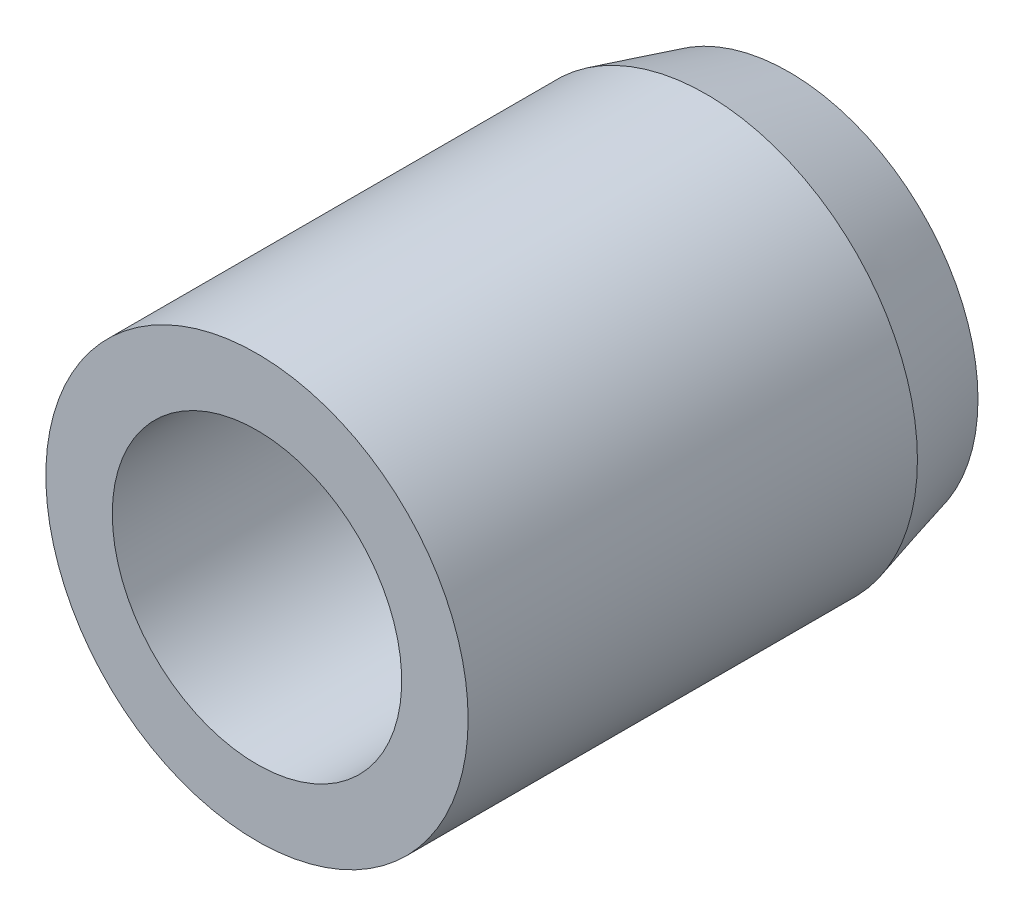
ISO-10303-21;
HEADER;
FILE_DESCRIPTION(('STEP AP214'),'2;1');
FILE_NAME('part.step','',(''),(''),'','','');
FILE_SCHEMA(('AUTOMOTIVE_DESIGN { 1 0 10303 214 1 1 1 1 }'));
ENDSEC;
DATA;
#1=APPLICATION_CONTEXT('core data for automotive mechanical design processes');
#2=APPLICATION_PROTOCOL_DEFINITION('international standard','automotive_design',2000,#1);
#3=PRODUCT_CONTEXT('',#1,'mechanical');
#4=PRODUCT('Part','Part','',(#3));
#5=PRODUCT_RELATED_PRODUCT_CATEGORY('part','',(#4));
#6=PRODUCT_DEFINITION_FORMATION('','',#4);
#7=PRODUCT_DEFINITION_CONTEXT('part definition',#1,'design');
#8=PRODUCT_DEFINITION('design','',#6,#7);
#9=PRODUCT_DEFINITION_SHAPE('','',#8);
#10=(LENGTH_UNIT() NAMED_UNIT(*) SI_UNIT(.MILLI.,.METRE.));
#11=(NAMED_UNIT(*) PLANE_ANGLE_UNIT() SI_UNIT($,.RADIAN.));
#12=(NAMED_UNIT(*) SI_UNIT($,.STERADIAN.) SOLID_ANGLE_UNIT());
#13=UNCERTAINTY_MEASURE_WITH_UNIT(LENGTH_MEASURE(1.E-05),#10,'distance_accuracy_value','');
#14=(GEOMETRIC_REPRESENTATION_CONTEXT(3) GLOBAL_UNCERTAINTY_ASSIGNED_CONTEXT((#13)) GLOBAL_UNIT_ASSIGNED_CONTEXT((#10,
#11,#12)) REPRESENTATION_CONTEXT('',''));
#15=CARTESIAN_POINT('',(0.,0.,0.));
#16=DIRECTION('',(0.,0.,1.));
#17=DIRECTION('',(1.,0.,0.));
#18=AXIS2_PLACEMENT_3D('',#15,#16,#17);
#19=CARTESIAN_POINT('',(0.,0.,12.));
#20=DIRECTION('',(0.,0.,-1.));
#21=DIRECTION('',(-1.,0.,0.));
#22=AXIS2_PLACEMENT_3D('',#19,#20,#21);
#23=CYLINDRICAL_SURFACE('',#22,4.7625);
#24=CARTESIAN_POINT('',(0.,0.,1.86602540378443));
#25=DIRECTION('',(0.,0.,1.));
#26=DIRECTION('',(1.,0.,0.));
#27=AXIS2_PLACEMENT_3D('',#24,#25,#26);
#28=CIRCLE('',#27,4.7625);
#29=CARTESIAN_POINT('',(4.7625,0.,1.86602540378443));
#30=VERTEX_POINT('',#29);
#31=EDGE_CURVE('E36',#30,#30,#28,.T.);
#32=ORIENTED_EDGE('',*,*,#31,.T.);
#33=EDGE_LOOP('',(#32));
#34=FACE_BOUND('',#33,.T.);
#35=CARTESIAN_POINT('',(0.,0.,12.));
#36=DIRECTION('',(0.,0.,1.));
#37=DIRECTION('',(1.,0.,0.));
#38=AXIS2_PLACEMENT_3D('',#35,#36,#37);
#39=CIRCLE('',#38,4.7625);
#40=CARTESIAN_POINT('',(4.7625,0.,12.));
#41=VERTEX_POINT('',#40);
#42=EDGE_CURVE('E40',#41,#41,#39,.T.);
#43=ORIENTED_EDGE('',*,*,#42,.F.);
#44=EDGE_LOOP('',(#43));
#45=FACE_BOUND('',#44,.T.);
#46=ADVANCED_FACE('F29',(#34,#45),#23,.T.);
#47=CARTESIAN_POINT('',(0.,0.,12.));
#48=DIRECTION('',(0.,0.,1.));
#49=DIRECTION('',(1.,0.,0.));
#50=AXIS2_PLACEMENT_3D('',#47,#48,#49);
#51=PLANE('',#50);
#52=CARTESIAN_POINT('',(0.,0.,12.));
#53=DIRECTION('',(0.,0.,-1.));
#54=DIRECTION('',(-1.,0.,0.));
#55=AXIS2_PLACEMENT_3D('',#52,#53,#54);
#56=CIRCLE('',#55,3.2639);
#57=CARTESIAN_POINT('',(-3.2639,0.,12.));
#58=VERTEX_POINT('',#57);
#59=EDGE_CURVE('E44',#58,#58,#56,.T.);
#60=ORIENTED_EDGE('',*,*,#59,.T.);
#61=EDGE_LOOP('',(#60));
#62=FACE_BOUND('',#61,.T.);
#63=ORIENTED_EDGE('',*,*,#42,.T.);
#64=EDGE_LOOP('',(#63));
#65=FACE_BOUND('',#64,.T.);
#66=ADVANCED_FACE('F57',(#62,#65),#51,.T.);
#67=CARTESIAN_POINT('',(0.,0.,0.));
#68=DIRECTION('',(0.,0.,1.));
#69=DIRECTION('',(1.,0.,0.));
#70=AXIS2_PLACEMENT_3D('',#67,#68,#69);
#71=PLANE('',#70);
#72=CARTESIAN_POINT('',(0.,0.,0.));
#73=DIRECTION('',(0.,0.,-1.));
#74=DIRECTION('',(-1.,0.,0.));
#75=AXIS2_PLACEMENT_3D('',#72,#73,#74);
#76=CIRCLE('',#75,3.2639);
#77=CARTESIAN_POINT('',(-3.2639,0.,0.));
#78=VERTEX_POINT('',#77);
#79=EDGE_CURVE('E49',#78,#78,#76,.T.);
#80=ORIENTED_EDGE('',*,*,#79,.F.);
#81=EDGE_LOOP('',(#80));
#82=FACE_BOUND('',#81,.T.);
#83=CARTESIAN_POINT('',(0.,0.,0.));
#84=DIRECTION('',(0.,0.,1.));
#85=DIRECTION('',(1.,0.,0.));
#86=AXIS2_PLACEMENT_3D('',#83,#84,#85);
#87=CIRCLE('',#86,4.2625);
#88=CARTESIAN_POINT('',(4.2625,0.,0.));
#89=VERTEX_POINT('',#88);
#90=EDGE_CURVE('E10',#89,#89,#87,.F.);
#91=ORIENTED_EDGE('',*,*,#90,.T.);
#92=EDGE_LOOP('',(#91));
#93=FACE_BOUND('',#92,.T.);
#94=ADVANCED_FACE('F55',(#82,#93),#71,.F.);
#95=CARTESIAN_POINT('',(0.,0.,1.86602540378443));
#96=DIRECTION('',(0.,0.,1.));
#97=DIRECTION('',(1.,0.,0.));
#98=AXIS2_PLACEMENT_3D('',#95,#96,#97);
#99=CONICAL_SURFACE('',#98,4.7625,0.26179938779915);
#100=ORIENTED_EDGE('',*,*,#90,.F.);
#101=EDGE_LOOP('',(#100));
#102=FACE_BOUND('',#101,.T.);
#103=ORIENTED_EDGE('',*,*,#31,.F.);
#104=EDGE_LOOP('',(#103));
#105=FACE_BOUND('',#104,.T.);
#106=ADVANCED_FACE('F31',(#102,#105),#99,.T.);
#107=CARTESIAN_POINT('',(0.,0.,0.));
#108=DIRECTION('',(0.,0.,-1.));
#109=DIRECTION('',(-1.,0.,0.));
#110=AXIS2_PLACEMENT_3D('',#107,#108,#109);
#111=CYLINDRICAL_SURFACE('',#110,3.2639);
#112=ORIENTED_EDGE('',*,*,#59,.F.);
#113=EDGE_LOOP('',(#112));
#114=FACE_BOUND('',#113,.T.);
#115=ORIENTED_EDGE('',*,*,#79,.T.);
#116=EDGE_LOOP('',(#115));
#117=FACE_BOUND('',#116,.T.);
#118=ADVANCED_FACE('F53',(#114,#117),#111,.F.);
#119=CLOSED_SHELL('',(#46,#66,#94,#106,#118));
#120=MANIFOLD_SOLID_BREP('B2',#119);
#121=ADVANCED_BREP_SHAPE_REPRESENTATION('',(#18,#120),#14);
#122=SHAPE_DEFINITION_REPRESENTATION(#9,#121);
ENDSEC;
END-ISO-10303-21;
